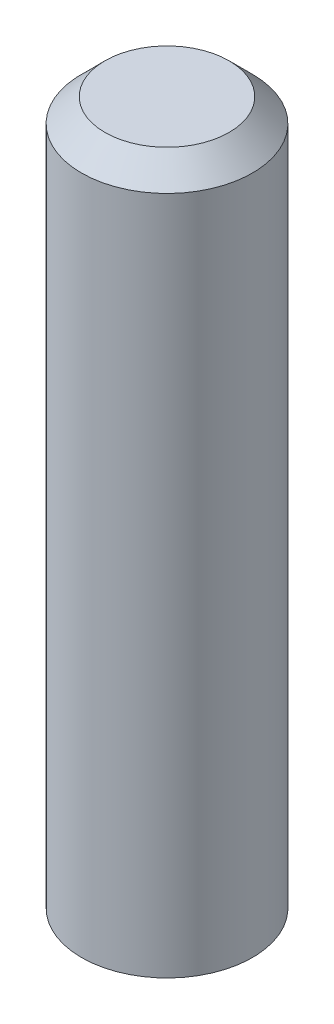
ISO-10303-21;
HEADER;
FILE_DESCRIPTION(('STEP AP214'),'2;1');
FILE_NAME('part.step','',(''),(''),'','','');
FILE_SCHEMA(('AUTOMOTIVE_DESIGN { 1 0 10303 214 1 1 1 1 }'));
ENDSEC;
DATA;
#1=APPLICATION_CONTEXT('core data for automotive mechanical design processes');
#2=APPLICATION_PROTOCOL_DEFINITION('international standard','automotive_design',2000,#1);
#3=PRODUCT_CONTEXT('',#1,'mechanical');
#4=PRODUCT('Part','Part','',(#3));
#5=PRODUCT_RELATED_PRODUCT_CATEGORY('part','',(#4));
#6=PRODUCT_DEFINITION_FORMATION('','',#4);
#7=PRODUCT_DEFINITION_CONTEXT('part definition',#1,'design');
#8=PRODUCT_DEFINITION('design','',#6,#7);
#9=PRODUCT_DEFINITION_SHAPE('','',#8);
#10=(LENGTH_UNIT() NAMED_UNIT(*) SI_UNIT(.MILLI.,.METRE.));
#11=(NAMED_UNIT(*) PLANE_ANGLE_UNIT() SI_UNIT($,.RADIAN.));
#12=(NAMED_UNIT(*) SI_UNIT($,.STERADIAN.) SOLID_ANGLE_UNIT());
#13=UNCERTAINTY_MEASURE_WITH_UNIT(LENGTH_MEASURE(1.E-05),#10,'distance_accuracy_value','');
#14=(GEOMETRIC_REPRESENTATION_CONTEXT(3) GLOBAL_UNCERTAINTY_ASSIGNED_CONTEXT((#13)) GLOBAL_UNIT_ASSIGNED_CONTEXT((#10,
#11,#12)) REPRESENTATION_CONTEXT('',''));
#15=CARTESIAN_POINT('',(0.,0.,0.));
#16=DIRECTION('',(0.,0.,1.));
#17=DIRECTION('',(1.,0.,0.));
#18=AXIS2_PLACEMENT_3D('',#15,#16,#17);
#19=CARTESIAN_POINT('',(0.,76.2,0.));
#20=DIRECTION('',(0.,-1.,0.));
#21=DIRECTION('',(0.,0.,-1.));
#22=AXIS2_PLACEMENT_3D('',#19,#20,#21);
#23=CYLINDRICAL_SURFACE('',#22,9.271);
#24=CARTESIAN_POINT('',(0.,73.66,0.));
#25=DIRECTION('',(0.,1.,0.));
#26=DIRECTION('',(0.,0.,1.));
#27=AXIS2_PLACEMENT_3D('',#24,#25,#26);
#28=CIRCLE('',#27,9.271);
#29=CARTESIAN_POINT('',(0.,73.66,-9.271));
#30=VERTEX_POINT('',#29);
#31=EDGE_CURVE('E10',#30,#30,#28,.F.);
#32=CARTESIAN_POINT('',(0.,0.,0.));
#33=DIRECTION('',(0.,1.,0.));
#34=DIRECTION('',(0.,0.,1.));
#35=AXIS2_PLACEMENT_3D('',#32,#33,#34);
#36=CIRCLE('',#35,9.271);
#37=CARTESIAN_POINT('',(0.,0.,-9.271));
#38=VERTEX_POINT('',#37);
#39=EDGE_CURVE('E47',#38,#38,#36,.T.);
#40=CARTESIAN_POINT('',(0.,73.66,-9.271));
#41=CARTESIAN_POINT('',(0.,72.8927083333334,-9.271));
#42=CARTESIAN_POINT('',(0.,72.1254166666667,-9.271));
#43=CARTESIAN_POINT('',(0.,70.5908333333334,-9.271));
#44=CARTESIAN_POINT('',(0.,69.8235416666667,-9.271));
#45=CARTESIAN_POINT('',(0.,68.2889583333334,-9.271));
#46=CARTESIAN_POINT('',(0.,67.5216666666667,-9.271));
#47=CARTESIAN_POINT('',(0.,65.9870833333334,-9.271));
#48=CARTESIAN_POINT('',(0.,65.2197916666667,-9.271));
#49=CARTESIAN_POINT('',(0.,63.6852083333334,-9.271));
#50=CARTESIAN_POINT('',(0.,62.9179166666667,-9.271));
#51=CARTESIAN_POINT('',(0.,61.3833333333334,-9.271));
#52=CARTESIAN_POINT('',(0.,60.6160416666667,-9.271));
#53=CARTESIAN_POINT('',(0.,59.0814583333334,-9.271));
#54=CARTESIAN_POINT('',(0.,58.3141666666667,-9.271));
#55=CARTESIAN_POINT('',(0.,56.7795833333334,-9.271));
#56=CARTESIAN_POINT('',(0.,56.0122916666667,-9.271));
#57=CARTESIAN_POINT('',(0.,54.4777083333334,-9.271));
#58=CARTESIAN_POINT('',(0.,53.7104166666667,-9.271));
#59=CARTESIAN_POINT('',(0.,52.1758333333334,-9.271));
#60=CARTESIAN_POINT('',(0.,51.4085416666667,-9.271));
#61=CARTESIAN_POINT('',(0.,49.8739583333334,-9.271));
#62=CARTESIAN_POINT('',(0.,49.1066666666667,-9.271));
#63=CARTESIAN_POINT('',(0.,47.5720833333334,-9.271));
#64=CARTESIAN_POINT('',(0.,46.8047916666667,-9.271));
#65=CARTESIAN_POINT('',(0.,45.2702083333334,-9.271));
#66=CARTESIAN_POINT('',(0.,44.5029166666667,-9.271));
#67=CARTESIAN_POINT('',(0.,42.9683333333333,-9.271));
#68=CARTESIAN_POINT('',(0.,42.2010416666667,-9.271));
#69=CARTESIAN_POINT('',(0.,40.6664583333334,-9.271));
#70=CARTESIAN_POINT('',(0.,39.8991666666667,-9.271));
#71=CARTESIAN_POINT('',(0.,38.3645833333333,-9.271));
#72=CARTESIAN_POINT('',(0.,37.5972916666667,-9.271));
#73=CARTESIAN_POINT('',(0.,36.0627083333333,-9.271));
#74=CARTESIAN_POINT('',(0.,35.2954166666667,-9.271));
#75=CARTESIAN_POINT('',(0.,33.7608333333333,-9.271));
#76=CARTESIAN_POINT('',(0.,32.9935416666667,-9.271));
#77=CARTESIAN_POINT('',(0.,31.4589583333333,-9.271));
#78=CARTESIAN_POINT('',(0.,30.6916666666667,-9.271));
#79=CARTESIAN_POINT('',(0.,29.1570833333333,-9.271));
#80=CARTESIAN_POINT('',(0.,28.3897916666667,-9.271));
#81=CARTESIAN_POINT('',(0.,26.8552083333333,-9.271));
#82=CARTESIAN_POINT('',(0.,26.0879166666667,-9.271));
#83=CARTESIAN_POINT('',(0.,24.5533333333333,-9.271));
#84=CARTESIAN_POINT('',(0.,23.7860416666667,-9.271));
#85=CARTESIAN_POINT('',(0.,22.2514583333333,-9.271));
#86=CARTESIAN_POINT('',(0.,21.4841666666667,-9.271));
#87=CARTESIAN_POINT('',(0.,19.9495833333333,-9.271));
#88=CARTESIAN_POINT('',(0.,19.1822916666667,-9.271));
#89=CARTESIAN_POINT('',(0.,17.6477083333333,-9.271));
#90=CARTESIAN_POINT('',(0.,16.8804166666667,-9.271));
#91=CARTESIAN_POINT('',(0.,15.3458333333333,-9.271));
#92=CARTESIAN_POINT('',(0.,14.5785416666667,-9.271));
#93=CARTESIAN_POINT('',(0.,13.0439583333333,-9.271));
#94=CARTESIAN_POINT('',(0.,12.2766666666667,-9.271));
#95=CARTESIAN_POINT('',(0.,10.7420833333333,-9.271));
#96=CARTESIAN_POINT('',(0.,9.97479166666667,-9.271));
#97=CARTESIAN_POINT('',(0.,8.44020833333334,-9.271));
#98=CARTESIAN_POINT('',(0.,7.67291666666667,-9.271));
#99=CARTESIAN_POINT('',(0.,6.13833333333333,-9.271));
#100=CARTESIAN_POINT('',(0.,5.37104166666666,-9.271));
#101=CARTESIAN_POINT('',(0.,3.83645833333333,-9.271));
#102=CARTESIAN_POINT('',(0.,3.06916666666667,-9.271));
#103=CARTESIAN_POINT('',(0.,1.53458333333334,-9.271));
#104=CARTESIAN_POINT('',(0.,0.767291666666669,-9.271));
#105=CARTESIAN_POINT('',(0.,0.,-9.271));
#106=B_SPLINE_CURVE_WITH_KNOTS('',3,(#40,#41,#42,#43,#44,#45,#46,#47,#48,#49,#50,#51,#52,#53,
#54,#55,#56,#57,#58,#59,#60,#61,#62,#63,#64,#65,#66,#67,#68,#69,#70,#71,#72,#73,#74,#75,#76,#77,
#78,#79,#80,#81,#82,#83,#84,#85,#86,#87,#88,#89,#90,#91,#92,#93,#94,#95,#96,#97,#98,#99,#100,
#101,#102,#103,#104,#105),.UNSPECIFIED.,.F.,.F.,(4,2,2,2,2,2,2,2,2,2,2,2,2,2,2,2,2,2,2,2,2,2,2,
2,2,2,2,2,2,2,2,2,4),(0.,2.30187500000001,4.60375,6.90562500000001,9.20750000000001,11.509375,
13.81125,16.113125,18.415,20.716875,23.01875,25.320625,27.6225,29.924375,32.22625,34.528125,
36.83,39.131875,41.43375,43.735625,46.0375,48.339375,50.64125,52.943125,55.245,57.546875,
59.84875,62.150625,64.4525,66.7543750000001,69.05625,71.358125,73.66),.UNSPECIFIED.);
#107=EDGE_CURVE('BSEAM35',#30,#38,#106,.T.);
#108=ORIENTED_EDGE('',*,*,#31,.T.);
#109=ORIENTED_EDGE('',*,*,#39,.T.);
#110=ORIENTED_EDGE('',*,*,#107,.T.);
#111=ORIENTED_EDGE('',*,*,#107,.F.);
#112=EDGE_LOOP('',(#108,#110,#109,#111));
#113=FACE_BOUND('',#112,.T.);
#114=ADVANCED_FACE('F35',(#113),#23,.T.);
#115=CARTESIAN_POINT('',(0.,76.2,0.));
#116=DIRECTION('',(0.,1.,0.));
#117=DIRECTION('',(0.,0.,1.));
#118=AXIS2_PLACEMENT_3D('',#115,#116,#117);
#119=PLANE('',#118);
#120=CARTESIAN_POINT('',(0.,76.2,0.));
#121=DIRECTION('',(0.,1.,0.));
#122=DIRECTION('',(0.,0.,1.));
#123=AXIS2_PLACEMENT_3D('',#120,#121,#122);
#124=CIRCLE('',#123,6.73100000000004);
#125=CARTESIAN_POINT('',(0.,76.2,6.73100000000004));
#126=VERTEX_POINT('',#125);
#127=EDGE_CURVE('E43',#126,#126,#124,.T.);
#128=ORIENTED_EDGE('',*,*,#127,.T.);
#129=EDGE_LOOP('',(#128));
#130=FACE_BOUND('',#129,.T.);
#131=ADVANCED_FACE('F57',(#130),#119,.T.);
#132=CARTESIAN_POINT('',(0.,0.,0.));
#133=DIRECTION('',(0.,1.,0.));
#134=DIRECTION('',(0.,0.,1.));
#135=AXIS2_PLACEMENT_3D('',#132,#133,#134);
#136=PLANE('',#135);
#137=ORIENTED_EDGE('',*,*,#39,.F.);
#138=EDGE_LOOP('',(#137));
#139=FACE_BOUND('',#138,.T.);
#140=ADVANCED_FACE('F55',(#139),#136,.F.);
#141=CARTESIAN_POINT('',(0.,76.2,0.));
#142=DIRECTION('',(0.,-1.,0.));
#143=DIRECTION('',(0.,0.,-1.));
#144=AXIS2_PLACEMENT_3D('',#141,#142,#143);
#145=CONICAL_SURFACE('',#144,6.73100000000004,0.785398163397449);
#146=ORIENTED_EDGE('',*,*,#31,.F.);
#147=EDGE_LOOP('',(#146));
#148=FACE_BOUND('',#147,.T.);
#149=ORIENTED_EDGE('',*,*,#127,.F.);
#150=EDGE_LOOP('',(#149));
#151=FACE_BOUND('',#150,.T.);
#152=ADVANCED_FACE('F38',(#148,#151),#145,.T.);
#153=CLOSED_SHELL('',(#114,#131,#140,#152));
#154=MANIFOLD_SOLID_BREP('B2',#153);
#155=ADVANCED_BREP_SHAPE_REPRESENTATION('',(#18,#154),#14);
#156=SHAPE_DEFINITION_REPRESENTATION(#9,#155);
ENDSEC;
END-ISO-10303-21;
